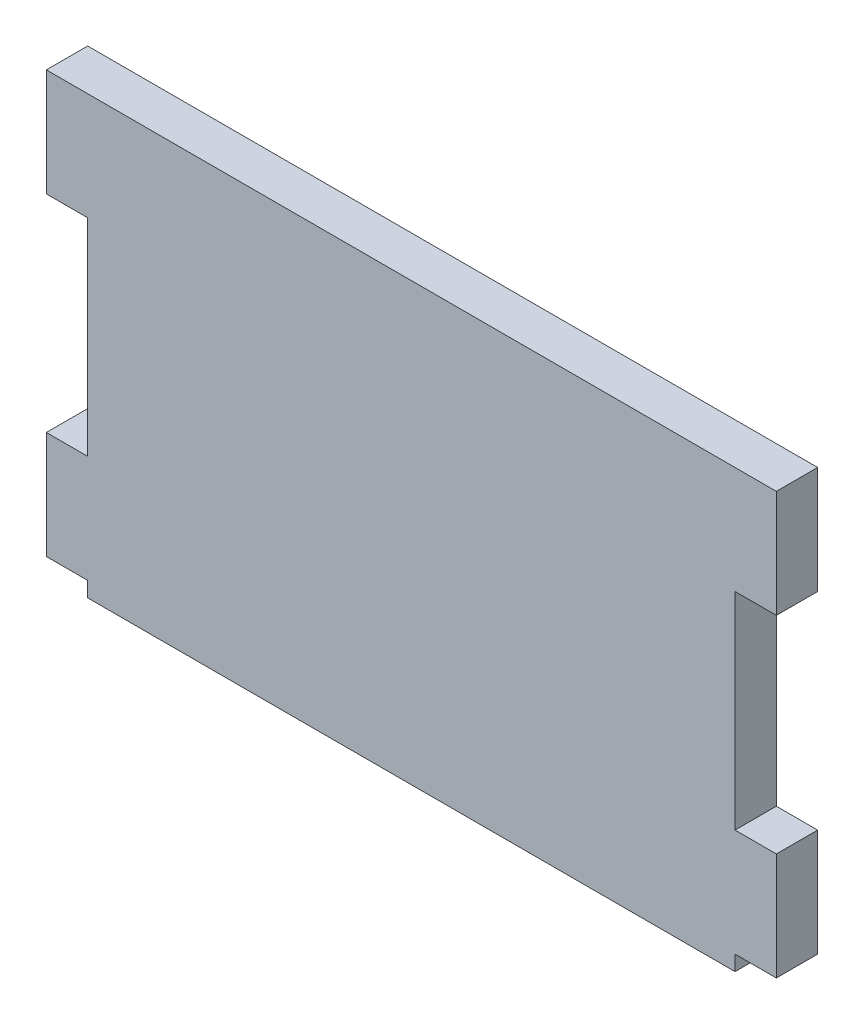
ISO-10303-21;
HEADER;
FILE_DESCRIPTION(('STEP AP214'),'2;1');
FILE_NAME('part.step','',(''),(''),'','','');
FILE_SCHEMA(('AUTOMOTIVE_DESIGN { 1 0 10303 214 1 1 1 1 }'));
ENDSEC;
DATA;
#1=APPLICATION_CONTEXT('core data for automotive mechanical design processes');
#2=APPLICATION_PROTOCOL_DEFINITION('international standard','automotive_design',2000,#1);
#3=PRODUCT_CONTEXT('',#1,'mechanical');
#4=PRODUCT('Part','Part','',(#3));
#5=PRODUCT_RELATED_PRODUCT_CATEGORY('part','',(#4));
#6=PRODUCT_DEFINITION_FORMATION('','',#4);
#7=PRODUCT_DEFINITION_CONTEXT('part definition',#1,'design');
#8=PRODUCT_DEFINITION('design','',#6,#7);
#9=PRODUCT_DEFINITION_SHAPE('','',#8);
#10=(LENGTH_UNIT() NAMED_UNIT(*) SI_UNIT(.MILLI.,.METRE.));
#11=(NAMED_UNIT(*) PLANE_ANGLE_UNIT() SI_UNIT($,.RADIAN.));
#12=(NAMED_UNIT(*) SI_UNIT($,.STERADIAN.) SOLID_ANGLE_UNIT());
#13=UNCERTAINTY_MEASURE_WITH_UNIT(LENGTH_MEASURE(1.E-05),#10,'distance_accuracy_value','');
#14=(GEOMETRIC_REPRESENTATION_CONTEXT(3) GLOBAL_UNCERTAINTY_ASSIGNED_CONTEXT((#13)) GLOBAL_UNIT_ASSIGNED_CONTEXT((#10,
#11,#12)) REPRESENTATION_CONTEXT('',''));
#15=CARTESIAN_POINT('',(0.,0.,0.));
#16=DIRECTION('',(0.,0.,1.));
#17=DIRECTION('',(1.,0.,0.));
#18=AXIS2_PLACEMENT_3D('',#15,#16,#17);
#19=CARTESIAN_POINT('',(-40.9934606481482,16.5420138888889,3.));
#20=DIRECTION('',(1.,0.,0.));
#21=DIRECTION('',(0.,0.,-1.));
#22=AXIS2_PLACEMENT_3D('',#19,#20,#21);
#23=PLANE('',#22);
#24=DIRECTION('',(0.,-1.,0.));
#25=VECTOR('',#24,1.);
#26=CARTESIAN_POINT('',(-40.9934606481482,16.5420138888889,0.));
#27=LINE('',#26,#25);
#28=CARTESIAN_POINT('',(-40.9934606481482,16.5420138888889,0.));
#29=VERTEX_POINT('',#28);
#30=CARTESIAN_POINT('',(-40.9934606481482,8.74201388888889,0.));
#31=VERTEX_POINT('',#30);
#32=EDGE_CURVE('E197',#29,#31,#27,.T.);
#33=ORIENTED_EDGE('',*,*,#32,.T.);
#34=DIRECTION('',(0.,0.,1.));
#35=VECTOR('',#34,1.);
#36=CARTESIAN_POINT('',(-40.9934606481482,8.74201388888889,0.));
#37=LINE('',#36,#35);
#38=CARTESIAN_POINT('',(-40.9934606481482,8.74201388888889,3.));
#39=VERTEX_POINT('',#38);
#40=EDGE_CURVE('E206',#31,#39,#37,.T.);
#41=ORIENTED_EDGE('',*,*,#40,.T.);
#42=DIRECTION('',(0.,-1.,0.));
#43=VECTOR('',#42,1.);
#44=CARTESIAN_POINT('',(-40.9934606481482,16.5420138888889,3.));
#45=LINE('',#44,#43);
#46=CARTESIAN_POINT('',(-40.9934606481482,16.5420138888889,3.));
#47=VERTEX_POINT('',#46);
#48=EDGE_CURVE('E214',#47,#39,#45,.T.);
#49=ORIENTED_EDGE('',*,*,#48,.F.);
#50=DIRECTION('',(0.,0.,-1.));
#51=VECTOR('',#50,1.);
#52=CARTESIAN_POINT('',(-40.9934606481482,16.5420138888889,3.));
#53=LINE('',#52,#51);
#54=EDGE_CURVE('E180',#47,#29,#53,.T.);
#55=ORIENTED_EDGE('',*,*,#54,.T.);
#56=EDGE_LOOP('',(#33,#41,#49,#55));
#57=FACE_BOUND('',#56,.T.);
#58=ADVANCED_FACE('F34',(#57),#23,.F.);
#59=CARTESIAN_POINT('',(12.0065393518518,16.5420138888889,3.));
#60=DIRECTION('',(-1.,0.,0.));
#61=DIRECTION('',(0.,-1.,0.));
#62=AXIS2_PLACEMENT_3D('',#59,#60,#61);
#63=PLANE('',#62);
#64=DIRECTION('',(0.,1.,0.));
#65=VECTOR('',#64,1.);
#66=CARTESIAN_POINT('',(12.0065393518518,16.5420138888889,3.));
#67=LINE('',#66,#65);
#68=CARTESIAN_POINT('',(12.0065393518518,-14.0579861111111,3.));
#69=VERTEX_POINT('',#68);
#70=CARTESIAN_POINT('',(12.0065393518519,-6.25798611111111,3.));
#71=VERTEX_POINT('',#70);
#72=EDGE_CURVE('E164',#69,#71,#67,.T.);
#73=ORIENTED_EDGE('',*,*,#72,.F.);
#74=DIRECTION('',(0.,0.,1.));
#75=VECTOR('',#74,1.);
#76=CARTESIAN_POINT('',(12.0065393518518,-14.0579861111111,0.));
#77=LINE('',#76,#75);
#78=CARTESIAN_POINT('',(12.0065393518518,-14.0579861111111,0.));
#79=VERTEX_POINT('',#78);
#80=EDGE_CURVE('E151',#79,#69,#77,.T.);
#81=ORIENTED_EDGE('',*,*,#80,.F.);
#82=DIRECTION('',(0.,1.,0.));
#83=VECTOR('',#82,1.);
#84=CARTESIAN_POINT('',(12.0065393518518,16.5420138888889,0.));
#85=LINE('',#84,#83);
#86=CARTESIAN_POINT('',(12.0065393518519,-6.25798611111111,0.));
#87=VERTEX_POINT('',#86);
#88=EDGE_CURVE('E162',#79,#87,#85,.T.);
#89=ORIENTED_EDGE('',*,*,#88,.T.);
#90=DIRECTION('',(0.,0.,1.));
#91=VECTOR('',#90,1.);
#92=CARTESIAN_POINT('',(12.0065393518519,-6.25798611111111,0.));
#93=LINE('',#92,#91);
#94=EDGE_CURVE('E223',#87,#71,#93,.T.);
#95=ORIENTED_EDGE('',*,*,#94,.T.);
#96=EDGE_LOOP('',(#73,#81,#89,#95));
#97=FACE_BOUND('',#96,.T.);
#98=ADVANCED_FACE('F160',(#97),#63,.F.);
#99=CARTESIAN_POINT('',(-40.9934606481481,-6.25798611111111,0.));
#100=VERTEX_POINT('',#99);
#101=CARTESIAN_POINT('',(-40.9934606481482,-14.0579861111111,0.));
#102=VERTEX_POINT('',#101);
#103=EDGE_CURVE('E203',#100,#102,#27,.T.);
#104=ORIENTED_EDGE('',*,*,#103,.T.);
#105=DIRECTION('',(0.,0.,1.));
#106=VECTOR('',#105,1.);
#107=CARTESIAN_POINT('',(-40.9934606481482,-14.0579861111111,0.));
#108=LINE('',#107,#106);
#109=CARTESIAN_POINT('',(-40.9934606481482,-14.0579861111111,3.));
#110=VERTEX_POINT('',#109);
#111=EDGE_CURVE('E266',#102,#110,#108,.T.);
#112=ORIENTED_EDGE('',*,*,#111,.T.);
#113=CARTESIAN_POINT('',(-40.9934606481481,-6.25798611111111,3.));
#114=VERTEX_POINT('',#113);
#115=EDGE_CURVE('E174',#114,#110,#45,.T.);
#116=ORIENTED_EDGE('',*,*,#115,.F.);
#117=DIRECTION('',(0.,0.,1.));
#118=VECTOR('',#117,1.);
#119=CARTESIAN_POINT('',(-40.9934606481481,-6.25798611111111,0.));
#120=LINE('',#119,#118);
#121=EDGE_CURVE('E241',#100,#114,#120,.T.);
#122=ORIENTED_EDGE('',*,*,#121,.F.);
#123=EDGE_LOOP('',(#104,#112,#116,#122));
#124=FACE_BOUND('',#123,.T.);
#125=ADVANCED_FACE('F36',(#124),#23,.F.);
#126=CARTESIAN_POINT('',(-40.9934606481482,-15.1579861111111,3.));
#127=DIRECTION('',(0.,1.,0.));
#128=DIRECTION('',(0.,0.,1.));
#129=AXIS2_PLACEMENT_3D('',#126,#127,#128);
#130=PLANE('',#129);
#131=DIRECTION('',(1.,0.,0.));
#132=VECTOR('',#131,1.);
#133=CARTESIAN_POINT('',(-40.9934606481482,-15.1579861111111,0.));
#134=LINE('',#133,#132);
#135=CARTESIAN_POINT('',(-37.9934606481482,-15.1579861111111,0.));
#136=VERTEX_POINT('',#135);
#137=CARTESIAN_POINT('',(9.00653935185184,-15.1579861111111,0.));
#138=VERTEX_POINT('',#137);
#139=EDGE_CURVE('E176',#136,#138,#134,.T.);
#140=ORIENTED_EDGE('',*,*,#139,.T.);
#141=DIRECTION('',(0.,0.,1.));
#142=VECTOR('',#141,1.);
#143=CARTESIAN_POINT('',(9.00653935185184,-15.1579861111111,3.));
#144=LINE('',#143,#142);
#145=CARTESIAN_POINT('',(9.00653935185184,-15.1579861111111,3.));
#146=VERTEX_POINT('',#145);
#147=EDGE_CURVE('E236',#138,#146,#144,.T.);
#148=ORIENTED_EDGE('',*,*,#147,.T.);
#149=DIRECTION('',(1.,0.,0.));
#150=VECTOR('',#149,1.);
#151=CARTESIAN_POINT('',(-40.9934606481482,-15.1579861111111,3.));
#152=LINE('',#151,#150);
#153=CARTESIAN_POINT('',(-37.9934606481482,-15.1579861111111,3.));
#154=VERTEX_POINT('',#153);
#155=EDGE_CURVE('E211',#154,#146,#152,.T.);
#156=ORIENTED_EDGE('',*,*,#155,.F.);
#157=DIRECTION('',(0.,0.,-1.));
#158=VECTOR('',#157,1.);
#159=CARTESIAN_POINT('',(-37.9934606481482,-15.1579861111111,3.));
#160=LINE('',#159,#158);
#161=EDGE_CURVE('E263',#154,#136,#160,.T.);
#162=ORIENTED_EDGE('',*,*,#161,.T.);
#163=EDGE_LOOP('',(#140,#148,#156,#162));
#164=FACE_BOUND('',#163,.T.);
#165=ADVANCED_FACE('F282',(#164),#130,.F.);
#166=CARTESIAN_POINT('',(12.0065393518519,8.74201388888887,3.));
#167=VERTEX_POINT('',#166);
#168=CARTESIAN_POINT('',(12.0065393518518,16.5420138888889,3.));
#169=VERTEX_POINT('',#168);
#170=EDGE_CURVE('E210',#167,#169,#67,.T.);
#171=ORIENTED_EDGE('',*,*,#170,.F.);
#172=DIRECTION('',(0.,0.,1.));
#173=VECTOR('',#172,1.);
#174=CARTESIAN_POINT('',(12.0065393518519,8.74201388888887,0.));
#175=LINE('',#174,#173);
#176=CARTESIAN_POINT('',(12.0065393518519,8.74201388888887,0.));
#177=VERTEX_POINT('',#176);
#178=EDGE_CURVE('E217',#177,#167,#175,.T.);
#179=ORIENTED_EDGE('',*,*,#178,.F.);
#180=CARTESIAN_POINT('',(12.0065393518518,16.5420138888889,0.));
#181=VERTEX_POINT('',#180);
#182=EDGE_CURVE('E172',#177,#181,#85,.T.);
#183=ORIENTED_EDGE('',*,*,#182,.T.);
#184=DIRECTION('',(0.,0.,-1.));
#185=VECTOR('',#184,1.);
#186=CARTESIAN_POINT('',(12.0065393518518,16.5420138888889,3.));
#187=LINE('',#186,#185);
#188=EDGE_CURVE('E42',#169,#181,#187,.T.);
#189=ORIENTED_EDGE('',*,*,#188,.F.);
#190=EDGE_LOOP('',(#171,#179,#183,#189));
#191=FACE_BOUND('',#190,.T.);
#192=ADVANCED_FACE('F311',(#191),#63,.F.);
#193=CARTESIAN_POINT('',(-40.9934606481482,16.5420138888889,3.));
#194=DIRECTION('',(0.,-1.,0.));
#195=DIRECTION('',(0.,0.,-1.));
#196=AXIS2_PLACEMENT_3D('',#193,#194,#195);
#197=PLANE('',#196);
#198=DIRECTION('',(-1.,0.,0.));
#199=VECTOR('',#198,1.);
#200=CARTESIAN_POINT('',(-40.9934606481482,16.5420138888889,0.));
#201=LINE('',#200,#199);
#202=EDGE_CURVE('E171',#181,#29,#201,.T.);
#203=ORIENTED_EDGE('',*,*,#202,.T.);
#204=ORIENTED_EDGE('',*,*,#54,.F.);
#205=DIRECTION('',(-1.,0.,0.));
#206=VECTOR('',#205,1.);
#207=CARTESIAN_POINT('',(-40.9934606481482,16.5420138888889,3.));
#208=LINE('',#207,#206);
#209=EDGE_CURVE('E182',#169,#47,#208,.T.);
#210=ORIENTED_EDGE('',*,*,#209,.F.);
#211=ORIENTED_EDGE('',*,*,#188,.T.);
#212=EDGE_LOOP('',(#203,#204,#210,#211));
#213=FACE_BOUND('',#212,.T.);
#214=ADVANCED_FACE('F188',(#213),#197,.F.);
#215=CARTESIAN_POINT('',(0.,0.,3.));
#216=DIRECTION('',(0.,0.,1.));
#217=DIRECTION('',(1.,0.,0.));
#218=AXIS2_PLACEMENT_3D('',#215,#216,#217);
#219=PLANE('',#218);
#220=DIRECTION('',(0.,-1.,0.));
#221=VECTOR('',#220,1.);
#222=CARTESIAN_POINT('',(9.00653935185184,-14.0579861111111,3.));
#223=LINE('',#222,#221);
#224=CARTESIAN_POINT('',(9.00653935185184,-14.0579861111111,3.));
#225=VERTEX_POINT('',#224);
#226=EDGE_CURVE('E156',#225,#146,#223,.T.);
#227=ORIENTED_EDGE('',*,*,#226,.F.);
#228=DIRECTION('',(-1.,0.,0.));
#229=VECTOR('',#228,1.);
#230=CARTESIAN_POINT('',(12.0065393518518,-14.0579861111111,3.));
#231=LINE('',#230,#229);
#232=EDGE_CURVE('E278',#69,#225,#231,.T.);
#233=ORIENTED_EDGE('',*,*,#232,.F.);
#234=ORIENTED_EDGE('',*,*,#72,.T.);
#235=DIRECTION('',(1.,0.,0.));
#236=VECTOR('',#235,1.);
#237=CARTESIAN_POINT('',(12.0065393518519,-6.25798611111111,3.));
#238=LINE('',#237,#236);
#239=CARTESIAN_POINT('',(9.00653935185186,-6.25798611111111,3.));
#240=VERTEX_POINT('',#239);
#241=EDGE_CURVE('E226',#240,#71,#238,.T.);
#242=ORIENTED_EDGE('',*,*,#241,.F.);
#243=DIRECTION('',(0.,-1.,0.));
#244=VECTOR('',#243,1.);
#245=CARTESIAN_POINT('',(9.00653935185186,8.74201388888887,3.));
#246=LINE('',#245,#244);
#247=CARTESIAN_POINT('',(9.00653935185186,8.74201388888887,3.));
#248=VERTEX_POINT('',#247);
#249=EDGE_CURVE('E230',#248,#240,#246,.T.);
#250=ORIENTED_EDGE('',*,*,#249,.F.);
#251=DIRECTION('',(-1.,0.,0.));
#252=VECTOR('',#251,1.);
#253=CARTESIAN_POINT('',(12.0065393518519,8.74201388888887,3.));
#254=LINE('',#253,#252);
#255=EDGE_CURVE('E233',#167,#248,#254,.T.);
#256=ORIENTED_EDGE('',*,*,#255,.F.);
#257=ORIENTED_EDGE('',*,*,#170,.T.);
#258=ORIENTED_EDGE('',*,*,#209,.T.);
#259=ORIENTED_EDGE('',*,*,#48,.T.);
#260=DIRECTION('',(-1.,0.,0.));
#261=VECTOR('',#260,1.);
#262=CARTESIAN_POINT('',(-40.9934606481482,8.74201388888889,3.));
#263=LINE('',#262,#261);
#264=CARTESIAN_POINT('',(-37.9934606481481,8.74201388888889,3.));
#265=VERTEX_POINT('',#264);
#266=EDGE_CURVE('E248',#265,#39,#263,.T.);
#267=ORIENTED_EDGE('',*,*,#266,.F.);
#268=DIRECTION('',(0.,1.,0.));
#269=VECTOR('',#268,1.);
#270=CARTESIAN_POINT('',(-37.9934606481481,8.74201388888889,3.));
#271=LINE('',#270,#269);
#272=CARTESIAN_POINT('',(-37.9934606481481,-6.25798611111111,3.));
#273=VERTEX_POINT('',#272);
#274=EDGE_CURVE('E251',#273,#265,#271,.T.);
#275=ORIENTED_EDGE('',*,*,#274,.F.);
#276=DIRECTION('',(1.,0.,0.));
#277=VECTOR('',#276,1.);
#278=CARTESIAN_POINT('',(-40.9934606481481,-6.25798611111111,3.));
#279=LINE('',#278,#277);
#280=EDGE_CURVE('E225',#114,#273,#279,.T.);
#281=ORIENTED_EDGE('',*,*,#280,.F.);
#282=ORIENTED_EDGE('',*,*,#115,.T.);
#283=DIRECTION('',(-1.,0.,0.));
#284=VECTOR('',#283,1.);
#285=CARTESIAN_POINT('',(-40.9934606481482,-14.0579861111111,3.));
#286=LINE('',#285,#284);
#287=CARTESIAN_POINT('',(-37.9934606481482,-14.0579861111111,3.));
#288=VERTEX_POINT('',#287);
#289=EDGE_CURVE('E271',#288,#110,#286,.T.);
#290=ORIENTED_EDGE('',*,*,#289,.F.);
#291=DIRECTION('',(0.,1.,0.));
#292=VECTOR('',#291,1.);
#293=CARTESIAN_POINT('',(-37.9934606481482,-14.0579861111111,3.));
#294=LINE('',#293,#292);
#295=EDGE_CURVE('E273',#154,#288,#294,.T.);
#296=ORIENTED_EDGE('',*,*,#295,.F.);
#297=ORIENTED_EDGE('',*,*,#155,.T.);
#298=EDGE_LOOP('',(#227,#233,#234,#242,#250,#256,#257,#258,#259,#267,#275,#281,#282,#290,#296,#297));
#299=FACE_BOUND('',#298,.T.);
#300=ADVANCED_FACE('F290',(#299),#219,.T.);
#301=CARTESIAN_POINT('',(0.,0.,0.));
#302=DIRECTION('',(0.,0.,1.));
#303=DIRECTION('',(1.,0.,0.));
#304=AXIS2_PLACEMENT_3D('',#301,#302,#303);
#305=PLANE('',#304);
#306=DIRECTION('',(-1.,0.,0.));
#307=VECTOR('',#306,1.);
#308=CARTESIAN_POINT('',(12.0065393518518,-14.0579861111111,0.));
#309=LINE('',#308,#307);
#310=CARTESIAN_POINT('',(9.00653935185184,-14.0579861111111,0.));
#311=VERTEX_POINT('',#310);
#312=EDGE_CURVE('E147',#79,#311,#309,.T.);
#313=ORIENTED_EDGE('',*,*,#312,.T.);
#314=DIRECTION('',(0.,-1.,0.));
#315=VECTOR('',#314,1.);
#316=CARTESIAN_POINT('',(9.00653935185184,-14.0579861111111,0.));
#317=LINE('',#316,#315);
#318=EDGE_CURVE('E49',#311,#138,#317,.T.);
#319=ORIENTED_EDGE('',*,*,#318,.T.);
#320=ORIENTED_EDGE('',*,*,#139,.F.);
#321=DIRECTION('',(0.,1.,0.));
#322=VECTOR('',#321,1.);
#323=CARTESIAN_POINT('',(-37.9934606481482,0.,0.));
#324=LINE('',#323,#322);
#325=CARTESIAN_POINT('',(-37.9934606481482,-14.0579861111111,0.));
#326=VERTEX_POINT('',#325);
#327=EDGE_CURVE('E11',#136,#326,#324,.T.);
#328=ORIENTED_EDGE('',*,*,#327,.T.);
#329=DIRECTION('',(-1.,0.,0.));
#330=VECTOR('',#329,1.);
#331=CARTESIAN_POINT('',(-40.9934606481482,-14.0579861111111,0.));
#332=LINE('',#331,#330);
#333=EDGE_CURVE('E57',#326,#102,#332,.T.);
#334=ORIENTED_EDGE('',*,*,#333,.T.);
#335=ORIENTED_EDGE('',*,*,#103,.F.);
#336=DIRECTION('',(1.,0.,0.));
#337=VECTOR('',#336,1.);
#338=CARTESIAN_POINT('',(-40.9934606481481,-6.25798611111111,0.));
#339=LINE('',#338,#337);
#340=CARTESIAN_POINT('',(-37.9934606481481,-6.25798611111111,0.));
#341=VERTEX_POINT('',#340);
#342=EDGE_CURVE('E250',#100,#341,#339,.T.);
#343=ORIENTED_EDGE('',*,*,#342,.T.);
#344=DIRECTION('',(0.,1.,0.));
#345=VECTOR('',#344,1.);
#346=CARTESIAN_POINT('',(-37.9934606481481,8.74201388888889,0.));
#347=LINE('',#346,#345);
#348=CARTESIAN_POINT('',(-37.9934606481481,8.74201388888889,0.));
#349=VERTEX_POINT('',#348);
#350=EDGE_CURVE('E257',#341,#349,#347,.T.);
#351=ORIENTED_EDGE('',*,*,#350,.T.);
#352=DIRECTION('',(-1.,0.,0.));
#353=VECTOR('',#352,1.);
#354=CARTESIAN_POINT('',(-40.9934606481482,8.74201388888889,0.));
#355=LINE('',#354,#353);
#356=EDGE_CURVE('E200',#349,#31,#355,.T.);
#357=ORIENTED_EDGE('',*,*,#356,.T.);
#358=ORIENTED_EDGE('',*,*,#32,.F.);
#359=ORIENTED_EDGE('',*,*,#202,.F.);
#360=ORIENTED_EDGE('',*,*,#182,.F.);
#361=DIRECTION('',(-1.,0.,0.));
#362=VECTOR('',#361,1.);
#363=CARTESIAN_POINT('',(12.0065393518519,8.74201388888887,0.));
#364=LINE('',#363,#362);
#365=CARTESIAN_POINT('',(9.00653935185186,8.74201388888887,0.));
#366=VERTEX_POINT('',#365);
#367=EDGE_CURVE('E229',#177,#366,#364,.T.);
#368=ORIENTED_EDGE('',*,*,#367,.T.);
#369=DIRECTION('',(0.,-1.,0.));
#370=VECTOR('',#369,1.);
#371=CARTESIAN_POINT('',(9.00653935185186,8.74201388888887,0.));
#372=LINE('',#371,#370);
#373=CARTESIAN_POINT('',(9.00653935185186,-6.25798611111111,0.));
#374=VERTEX_POINT('',#373);
#375=EDGE_CURVE('E238',#366,#374,#372,.T.);
#376=ORIENTED_EDGE('',*,*,#375,.T.);
#377=DIRECTION('',(1.,0.,0.));
#378=VECTOR('',#377,1.);
#379=CARTESIAN_POINT('',(12.0065393518519,-6.25798611111111,0.));
#380=LINE('',#379,#378);
#381=EDGE_CURVE('E170',#374,#87,#380,.T.);
#382=ORIENTED_EDGE('',*,*,#381,.T.);
#383=ORIENTED_EDGE('',*,*,#88,.F.);
#384=EDGE_LOOP('',(#313,#319,#320,#328,#334,#335,#343,#351,#357,#358,#359,#360,#368,#376,#382,#383));
#385=FACE_BOUND('',#384,.T.);
#386=ADVANCED_FACE('F167',(#385),#305,.F.);
#387=CARTESIAN_POINT('',(12.0065393518519,-6.25798611111111,0.));
#388=DIRECTION('',(0.,-1.,0.));
#389=DIRECTION('',(0.,0.,-1.));
#390=AXIS2_PLACEMENT_3D('',#387,#388,#389);
#391=PLANE('',#390);
#392=ORIENTED_EDGE('',*,*,#241,.T.);
#393=ORIENTED_EDGE('',*,*,#94,.F.);
#394=ORIENTED_EDGE('',*,*,#381,.F.);
#395=DIRECTION('',(0.,0.,1.));
#396=VECTOR('',#395,1.);
#397=CARTESIAN_POINT('',(9.00653935185186,-6.25798611111111,0.));
#398=LINE('',#397,#396);
#399=EDGE_CURVE('E221',#374,#240,#398,.T.);
#400=ORIENTED_EDGE('',*,*,#399,.T.);
#401=EDGE_LOOP('',(#392,#393,#394,#400));
#402=FACE_BOUND('',#401,.T.);
#403=ADVANCED_FACE('F319',(#402),#391,.F.);
#404=CARTESIAN_POINT('',(9.00653935185186,8.74201388888887,0.));
#405=DIRECTION('',(-1.,0.,0.));
#406=DIRECTION('',(0.,-1.,0.));
#407=AXIS2_PLACEMENT_3D('',#404,#405,#406);
#408=PLANE('',#407);
#409=ORIENTED_EDGE('',*,*,#249,.T.);
#410=ORIENTED_EDGE('',*,*,#399,.F.);
#411=ORIENTED_EDGE('',*,*,#375,.F.);
#412=DIRECTION('',(0.,0.,1.));
#413=VECTOR('',#412,1.);
#414=CARTESIAN_POINT('',(9.00653935185186,8.74201388888887,0.));
#415=LINE('',#414,#413);
#416=EDGE_CURVE('E219',#366,#248,#415,.T.);
#417=ORIENTED_EDGE('',*,*,#416,.T.);
#418=EDGE_LOOP('',(#409,#410,#411,#417));
#419=FACE_BOUND('',#418,.T.);
#420=ADVANCED_FACE('F316',(#419),#408,.F.);
#421=CARTESIAN_POINT('',(12.0065393518519,8.74201388888887,0.));
#422=DIRECTION('',(0.,1.,0.));
#423=DIRECTION('',(-1.,0.,0.));
#424=AXIS2_PLACEMENT_3D('',#421,#422,#423);
#425=PLANE('',#424);
#426=ORIENTED_EDGE('',*,*,#255,.T.);
#427=ORIENTED_EDGE('',*,*,#416,.F.);
#428=ORIENTED_EDGE('',*,*,#367,.F.);
#429=ORIENTED_EDGE('',*,*,#178,.T.);
#430=EDGE_LOOP('',(#426,#427,#428,#429));
#431=FACE_BOUND('',#430,.T.);
#432=ADVANCED_FACE('F313',(#431),#425,.F.);
#433=CARTESIAN_POINT('',(-40.9934606481482,8.74201388888889,0.));
#434=DIRECTION('',(0.,1.,0.));
#435=DIRECTION('',(0.,0.,1.));
#436=AXIS2_PLACEMENT_3D('',#433,#434,#435);
#437=PLANE('',#436);
#438=ORIENTED_EDGE('',*,*,#266,.T.);
#439=ORIENTED_EDGE('',*,*,#40,.F.);
#440=ORIENTED_EDGE('',*,*,#356,.F.);
#441=DIRECTION('',(0.,0.,1.));
#442=VECTOR('',#441,1.);
#443=CARTESIAN_POINT('',(-37.9934606481481,8.74201388888889,0.));
#444=LINE('',#443,#442);
#445=EDGE_CURVE('E245',#349,#265,#444,.T.);
#446=ORIENTED_EDGE('',*,*,#445,.T.);
#447=EDGE_LOOP('',(#438,#439,#440,#446));
#448=FACE_BOUND('',#447,.T.);
#449=ADVANCED_FACE('F306',(#448),#437,.F.);
#450=CARTESIAN_POINT('',(-37.9934606481481,8.74201388888889,0.));
#451=DIRECTION('',(1.,0.,0.));
#452=DIRECTION('',(0.,0.,-1.));
#453=AXIS2_PLACEMENT_3D('',#450,#451,#452);
#454=PLANE('',#453);
#455=ORIENTED_EDGE('',*,*,#274,.T.);
#456=ORIENTED_EDGE('',*,*,#445,.F.);
#457=ORIENTED_EDGE('',*,*,#350,.F.);
#458=DIRECTION('',(0.,0.,1.));
#459=VECTOR('',#458,1.);
#460=CARTESIAN_POINT('',(-37.9934606481481,-6.25798611111111,0.));
#461=LINE('',#460,#459);
#462=EDGE_CURVE('E243',#341,#273,#461,.T.);
#463=ORIENTED_EDGE('',*,*,#462,.T.);
#464=EDGE_LOOP('',(#455,#456,#457,#463));
#465=FACE_BOUND('',#464,.T.);
#466=ADVANCED_FACE('F303',(#465),#454,.F.);
#467=CARTESIAN_POINT('',(-40.9934606481481,-6.25798611111111,0.));
#468=DIRECTION('',(0.,-1.,0.));
#469=DIRECTION('',(1.,0.,0.));
#470=AXIS2_PLACEMENT_3D('',#467,#468,#469);
#471=PLANE('',#470);
#472=ORIENTED_EDGE('',*,*,#280,.T.);
#473=ORIENTED_EDGE('',*,*,#462,.F.);
#474=ORIENTED_EDGE('',*,*,#342,.F.);
#475=ORIENTED_EDGE('',*,*,#121,.T.);
#476=EDGE_LOOP('',(#472,#473,#474,#475));
#477=FACE_BOUND('',#476,.T.);
#478=ADVANCED_FACE('F300',(#477),#471,.F.);
#479=CARTESIAN_POINT('',(-37.9934606481482,-14.0579861111111,0.));
#480=DIRECTION('',(1.,0.,0.));
#481=DIRECTION('',(0.,0.,-1.));
#482=AXIS2_PLACEMENT_3D('',#479,#480,#481);
#483=PLANE('',#482);
#484=ORIENTED_EDGE('',*,*,#295,.T.);
#485=DIRECTION('',(0.,0.,1.));
#486=VECTOR('',#485,1.);
#487=CARTESIAN_POINT('',(-37.9934606481482,-14.0579861111111,0.));
#488=LINE('',#487,#486);
#489=EDGE_CURVE('E267',#326,#288,#488,.T.);
#490=ORIENTED_EDGE('',*,*,#489,.F.);
#491=ORIENTED_EDGE('',*,*,#327,.F.);
#492=ORIENTED_EDGE('',*,*,#161,.F.);
#493=EDGE_LOOP('',(#484,#490,#491,#492));
#494=FACE_BOUND('',#493,.T.);
#495=ADVANCED_FACE('F286',(#494),#483,.F.);
#496=CARTESIAN_POINT('',(-40.9934606481482,-14.0579861111111,0.));
#497=DIRECTION('',(0.,1.,0.));
#498=DIRECTION('',(0.,0.,1.));
#499=AXIS2_PLACEMENT_3D('',#496,#497,#498);
#500=PLANE('',#499);
#501=ORIENTED_EDGE('',*,*,#289,.T.);
#502=ORIENTED_EDGE('',*,*,#111,.F.);
#503=ORIENTED_EDGE('',*,*,#333,.F.);
#504=ORIENTED_EDGE('',*,*,#489,.T.);
#505=EDGE_LOOP('',(#501,#502,#503,#504));
#506=FACE_BOUND('',#505,.T.);
#507=ADVANCED_FACE('F294',(#506),#500,.F.);
#508=CARTESIAN_POINT('',(9.00653935185184,-14.0579861111111,0.));
#509=DIRECTION('',(-1.,0.,0.));
#510=DIRECTION('',(0.,-1.,0.));
#511=AXIS2_PLACEMENT_3D('',#508,#509,#510);
#512=PLANE('',#511);
#513=ORIENTED_EDGE('',*,*,#318,.F.);
#514=DIRECTION('',(0.,0.,1.));
#515=VECTOR('',#514,1.);
#516=CARTESIAN_POINT('',(9.00653935185184,-14.0579861111111,0.));
#517=LINE('',#516,#515);
#518=EDGE_CURVE('E153',#311,#225,#517,.T.);
#519=ORIENTED_EDGE('',*,*,#518,.T.);
#520=ORIENTED_EDGE('',*,*,#226,.T.);
#521=ORIENTED_EDGE('',*,*,#147,.F.);
#522=EDGE_LOOP('',(#513,#519,#520,#521));
#523=FACE_BOUND('',#522,.T.);
#524=ADVANCED_FACE('F320',(#523),#512,.F.);
#525=CARTESIAN_POINT('',(12.0065393518518,-14.0579861111111,0.));
#526=DIRECTION('',(0.,1.,0.));
#527=DIRECTION('',(-1.,0.,0.));
#528=AXIS2_PLACEMENT_3D('',#525,#526,#527);
#529=PLANE('',#528);
#530=ORIENTED_EDGE('',*,*,#232,.T.);
#531=ORIENTED_EDGE('',*,*,#518,.F.);
#532=ORIENTED_EDGE('',*,*,#312,.F.);
#533=ORIENTED_EDGE('',*,*,#80,.T.);
#534=EDGE_LOOP('',(#530,#531,#532,#533));
#535=FACE_BOUND('',#534,.T.);
#536=ADVANCED_FACE('F150',(#535),#529,.F.);
#537=CLOSED_SHELL('',(#58,#98,#125,#165,#192,#214,#300,#386,#403,#420,#432,#449,#466,#478,#495,
#507,#524,#536));
#538=MANIFOLD_SOLID_BREP('B2',#537);
#539=ADVANCED_BREP_SHAPE_REPRESENTATION('',(#18,#538),#14);
#540=SHAPE_DEFINITION_REPRESENTATION(#9,#539);
ENDSEC;
END-ISO-10303-21;
